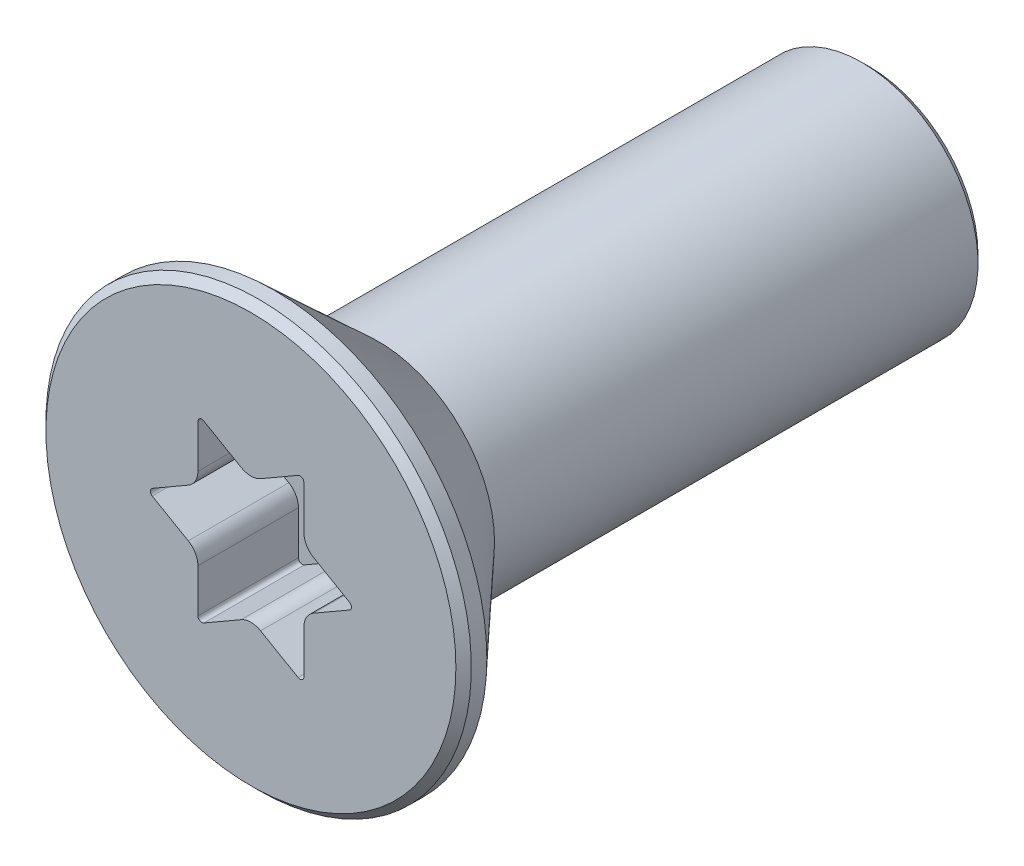
ISO-10303-21;
HEADER;
FILE_DESCRIPTION(('STEP AP214'),'2;1');
FILE_NAME('part.step','',(''),(''),'','','');
FILE_SCHEMA(('AUTOMOTIVE_DESIGN { 1 0 10303 214 1 1 1 1 }'));
ENDSEC;
DATA;
#1=APPLICATION_CONTEXT('core data for automotive mechanical design processes');
#2=APPLICATION_PROTOCOL_DEFINITION('international standard','automotive_design',2000,#1);
#3=PRODUCT_CONTEXT('',#1,'mechanical');
#4=PRODUCT('Part','Part','',(#3));
#5=PRODUCT_RELATED_PRODUCT_CATEGORY('part','',(#4));
#6=PRODUCT_DEFINITION_FORMATION('','',#4);
#7=PRODUCT_DEFINITION_CONTEXT('part definition',#1,'design');
#8=PRODUCT_DEFINITION('design','',#6,#7);
#9=PRODUCT_DEFINITION_SHAPE('','',#8);
#10=(LENGTH_UNIT() NAMED_UNIT(*) SI_UNIT(.MILLI.,.METRE.));
#11=(NAMED_UNIT(*) PLANE_ANGLE_UNIT() SI_UNIT($,.RADIAN.));
#12=(NAMED_UNIT(*) SI_UNIT($,.STERADIAN.) SOLID_ANGLE_UNIT());
#13=UNCERTAINTY_MEASURE_WITH_UNIT(LENGTH_MEASURE(1.E-05),#10,'distance_accuracy_value','');
#14=(GEOMETRIC_REPRESENTATION_CONTEXT(3) GLOBAL_UNCERTAINTY_ASSIGNED_CONTEXT((#13)) GLOBAL_UNIT_ASSIGNED_CONTEXT((#10,
#11,#12)) REPRESENTATION_CONTEXT('',''));
#15=CARTESIAN_POINT('',(0.,0.,0.));
#16=DIRECTION('',(0.,0.,1.));
#17=DIRECTION('',(1.,0.,0.));
#18=AXIS2_PLACEMENT_3D('',#15,#16,#17);
#19=CARTESIAN_POINT('',(7.2,-9.399999999998,210.95));
#20=DIRECTION('',(0.,0.,1.));
#21=DIRECTION('',(1.,0.,0.));
#22=AXIS2_PLACEMENT_3D('',#19,#20,#21);
#23=PLANE('',#22);
#24=CARTESIAN_POINT('',(7.2,-8.331902001998,210.95));
#25=DIRECTION('',(0.,0.,1.));
#26=DIRECTION('',(1.,0.,0.));
#27=AXIS2_PLACEMENT_3D('',#24,#25,#26);
#28=CIRCLE('',#27,0.25);
#29=CARTESIAN_POINT('',(7.07499999999879,-8.54840835294369,210.95));
#30=VERTEX_POINT('',#29);
#31=CARTESIAN_POINT('',(7.32500000000069,-8.54840835294385,210.95));
#32=VERTEX_POINT('',#31);
#33=EDGE_CURVE('E252',#30,#32,#28,.T.);
#34=ORIENTED_EDGE('',*,*,#33,.F.);
#35=DIRECTION('',(-0.866025403783983,0.50000000000079,0.));
#36=VECTOR('',#35,1.);
#37=CARTESIAN_POINT('',(6.832420150551,-8.408354811565,210.95));
#38=LINE('',#37,#36);
#39=CARTESIAN_POINT('',(6.58984030110494,-8.26830127018704,210.95));
#40=VERTEX_POINT('',#39);
#41=EDGE_CURVE('E348',#30,#40,#38,.T.);
#42=ORIENTED_EDGE('',*,*,#41,.T.);
#43=CARTESIAN_POINT('',(6.564840301107,-8.311602540377,210.95));
#44=DIRECTION('',(0.,0.,1.));
#45=DIRECTION('',(1.,0.,0.));
#46=AXIS2_PLACEMENT_3D('',#43,#44,#45);
#47=CIRCLE('',#46,0.05);
#48=CARTESIAN_POINT('',(6.514840301107,-8.311602539106,210.95));
#49=VERTEX_POINT('',#48);
#50=EDGE_CURVE('E248',#40,#49,#47,.T.);
#51=ORIENTED_EDGE('',*,*,#50,.T.);
#52=DIRECTION('',(0.,1.,0.));
#53=VECTOR('',#52,1.);
#54=CARTESIAN_POINT('',(6.514840301107,-8.591709615508,210.95));
#55=LINE('',#54,#53);
#56=CARTESIAN_POINT('',(6.514840301107,-8.871816705889,210.95));
#57=VERTEX_POINT('',#56);
#58=EDGE_CURVE('E251',#57,#49,#55,.T.);
#59=ORIENTED_EDGE('',*,*,#58,.F.);
#60=CARTESIAN_POINT('',(6.264840301107,-8.871816705889,210.95));
#61=DIRECTION('',(0.,0.,1.));
#62=DIRECTION('',(1.,0.,0.));
#63=AXIS2_PLACEMENT_3D('',#60,#61,#62);
#64=CIRCLE('',#63,0.25);
#65=CARTESIAN_POINT('',(6.38984030110702,-9.08832305683516,210.95));
#66=VERTEX_POINT('',#65);
#67=EDGE_CURVE('E244',#66,#57,#64,.T.);
#68=ORIENTED_EDGE('',*,*,#67,.F.);
#69=DIRECTION('',(-0.866025403784609,-0.499999999999705,0.));
#70=VECTOR('',#69,1.);
#71=CARTESIAN_POINT('',(6.157420150554,-9.222510893322,210.95));
#72=LINE('',#71,#70);
#73=CARTESIAN_POINT('',(5.92499999999999,-9.35669872980935,210.95));
#74=VERTEX_POINT('',#73);
#75=EDGE_CURVE('E343',#66,#74,#72,.T.);
#76=ORIENTED_EDGE('',*,*,#75,.T.);
#77=CARTESIAN_POINT('',(5.95,-9.399999999999,210.95));
#78=DIRECTION('',(0.,0.,1.));
#79=DIRECTION('',(1.,0.,0.));
#80=AXIS2_PLACEMENT_3D('',#77,#78,#79);
#81=CIRCLE('',#80,0.05);
#82=CARTESIAN_POINT('',(5.92499999999996,-9.4433012701882,210.95));
#83=VERTEX_POINT('',#82);
#84=EDGE_CURVE('E240',#74,#83,#81,.T.);
#85=ORIENTED_EDGE('',*,*,#84,.T.);
#86=DIRECTION('',(-0.866025403784609,0.499999999999705,0.));
#87=VECTOR('',#86,1.);
#88=CARTESIAN_POINT('',(6.157420150553,-9.577489106675,210.95));
#89=LINE('',#88,#87);
#90=CARTESIAN_POINT('',(6.38984030110658,-9.7116769431621,210.95));
#91=VERTEX_POINT('',#90);
#92=EDGE_CURVE('E243',#91,#83,#89,.T.);
#93=ORIENTED_EDGE('',*,*,#92,.F.);
#94=CARTESIAN_POINT('',(6.264840301107,-9.928183294108,210.95));
#95=DIRECTION('',(0.,0.,1.));
#96=DIRECTION('',(1.,0.,0.));
#97=AXIS2_PLACEMENT_3D('',#94,#95,#96);
#98=CIRCLE('',#97,0.250000000002);
#99=CARTESIAN_POINT('',(6.514840301108,-9.928183294108,210.95));
#100=VERTEX_POINT('',#99);
#101=EDGE_CURVE('E236',#100,#91,#98,.T.);
#102=ORIENTED_EDGE('',*,*,#101,.F.);
#103=DIRECTION('',(0.,1.,0.));
#104=VECTOR('',#103,1.);
#105=CARTESIAN_POINT('',(6.514840301107,-10.20829038449,210.95));
#106=LINE('',#105,#104);
#107=CARTESIAN_POINT('',(6.514840301107,-10.48839745962,210.95));
#108=VERTEX_POINT('',#107);
#109=EDGE_CURVE('E338',#108,#100,#106,.T.);
#110=ORIENTED_EDGE('',*,*,#109,.F.);
#111=CARTESIAN_POINT('',(6.564840301107,-10.48839745962,210.95));
#112=DIRECTION('',(0.,0.,1.));
#113=DIRECTION('',(1.,0.,0.));
#114=AXIS2_PLACEMENT_3D('',#111,#112,#113);
#115=CIRCLE('',#114,0.05);
#116=CARTESIAN_POINT('',(6.58984030110536,-10.53169872981,210.95));
#117=VERTEX_POINT('',#116);
#118=EDGE_CURVE('E232',#108,#117,#115,.T.);
#119=ORIENTED_EDGE('',*,*,#118,.T.);
#120=DIRECTION('',(-0.866025403781719,-0.500000000004711,0.));
#121=VECTOR('',#120,1.);
#122=CARTESIAN_POINT('',(6.832420150552,-10.39164518843,210.95));
#123=LINE('',#122,#121);
#124=CARTESIAN_POINT('',(7.07499999999758,-10.2515916470509,210.95));
#125=VERTEX_POINT('',#124);
#126=EDGE_CURVE('E235',#125,#117,#123,.T.);
#127=ORIENTED_EDGE('',*,*,#126,.F.);
#128=CARTESIAN_POINT('',(7.2,-10.468097998,210.95));
#129=DIRECTION('',(0.,0.,1.));
#130=DIRECTION('',(1.,0.,0.));
#131=AXIS2_PLACEMENT_3D('',#128,#129,#130);
#132=CIRCLE('',#131,0.25);
#133=CARTESIAN_POINT('',(7.32500000000358,-10.2515916470536,210.95));
#134=VERTEX_POINT('',#133);
#135=EDGE_CURVE('E228',#134,#125,#132,.T.);
#136=ORIENTED_EDGE('',*,*,#135,.F.);
#137=DIRECTION('',(-0.86602540378219,0.500000000003894,0.));
#138=VECTOR('',#137,1.);
#139=CARTESIAN_POINT('',(7.567579849449,-10.39164518843,210.95));
#140=LINE('',#139,#138);
#141=CARTESIAN_POINT('',(7.81015969889588,-10.5316987298096,210.95));
#142=VERTEX_POINT('',#141);
#143=EDGE_CURVE('E333',#142,#134,#140,.T.);
#144=ORIENTED_EDGE('',*,*,#143,.F.);
#145=CARTESIAN_POINT('',(7.835159698894,-10.48839745962,210.95));
#146=DIRECTION('',(0.,0.,1.));
#147=DIRECTION('',(1.,0.,0.));
#148=AXIS2_PLACEMENT_3D('',#145,#146,#147);
#149=CIRCLE('',#148,0.05);
#150=CARTESIAN_POINT('',(7.885159698894,-10.48839748249,210.95));
#151=VERTEX_POINT('',#150);
#152=EDGE_CURVE('E221',#142,#151,#149,.T.);
#153=ORIENTED_EDGE('',*,*,#152,.T.);
#154=DIRECTION('',(0.,1.,0.));
#155=VECTOR('',#154,1.);
#156=CARTESIAN_POINT('',(7.885159698894,-10.20829038449,210.95));
#157=LINE('',#156,#155);
#158=CARTESIAN_POINT('',(7.885159698894,-9.928183294108,210.95));
#159=VERTEX_POINT('',#158);
#160=EDGE_CURVE('E219',#151,#159,#157,.T.);
#161=ORIENTED_EDGE('',*,*,#160,.T.);
#162=CARTESIAN_POINT('',(8.135159698894,-9.928183294108,210.95));
#163=DIRECTION('',(0.,0.,1.));
#164=DIRECTION('',(1.,0.,0.));
#165=AXIS2_PLACEMENT_3D('',#162,#163,#164);
#166=CIRCLE('',#165,0.250000000002);
#167=CARTESIAN_POINT('',(8.01015969889355,-9.71167694316094,210.95));
#168=VERTEX_POINT('',#167);
#169=EDGE_CURVE('E216',#168,#159,#166,.T.);
#170=ORIENTED_EDGE('',*,*,#169,.F.);
#171=DIRECTION('',(-0.866025403784609,-0.499999999999705,0.));
#172=VECTOR('',#171,1.);
#173=CARTESIAN_POINT('',(8.242579849447,-9.577489106675,210.95));
#174=LINE('',#173,#172);
#175=CARTESIAN_POINT('',(8.47500000000005,-9.44330127018821,210.95));
#176=VERTEX_POINT('',#175);
#177=EDGE_CURVE('E329',#176,#168,#174,.T.);
#178=ORIENTED_EDGE('',*,*,#177,.F.);
#179=CARTESIAN_POINT('',(8.45,-9.399999999999,210.95));
#180=DIRECTION('',(0.,0.,1.));
#181=DIRECTION('',(1.,0.,0.));
#182=AXIS2_PLACEMENT_3D('',#179,#180,#181);
#183=CIRCLE('',#182,0.05);
#184=CARTESIAN_POINT('',(8.47499999999996,-9.35669872980947,210.95));
#185=VERTEX_POINT('',#184);
#186=EDGE_CURVE('E212',#176,#185,#183,.T.);
#187=ORIENTED_EDGE('',*,*,#186,.T.);
#188=DIRECTION('',(-0.866025403784274,0.500000000000285,0.));
#189=VECTOR('',#188,1.);
#190=CARTESIAN_POINT('',(8.2425798494469,-9.22251089332218,210.95));
#191=LINE('',#190,#189);
#192=CARTESIAN_POINT('',(8.01015969889387,-9.0883230568352,210.95));
#193=VERTEX_POINT('',#192);
#194=EDGE_CURVE('E211',#185,#193,#191,.T.);
#195=ORIENTED_EDGE('',*,*,#194,.T.);
#196=CARTESIAN_POINT('',(8.135159698894,-8.871816705889,210.95));
#197=DIRECTION('',(0.,0.,1.));
#198=DIRECTION('',(1.,0.,0.));
#199=AXIS2_PLACEMENT_3D('',#196,#197,#198);
#200=CIRCLE('',#199,0.25);
#201=CARTESIAN_POINT('',(7.885159698894,-8.871816705889,210.95));
#202=VERTEX_POINT('',#201);
#203=EDGE_CURVE('E199',#202,#193,#200,.T.);
#204=ORIENTED_EDGE('',*,*,#203,.F.);
#205=DIRECTION('',(0.,1.,0.));
#206=VECTOR('',#205,1.);
#207=CARTESIAN_POINT('',(7.885159698894,-8.591709615508,210.95));
#208=LINE('',#207,#206);
#209=CARTESIAN_POINT('',(7.885159698894,-8.3116025289405,210.95));
#210=VERTEX_POINT('',#209);
#211=EDGE_CURVE('E197',#202,#210,#208,.T.);
#212=ORIENTED_EDGE('',*,*,#211,.T.);
#213=CARTESIAN_POINT('',(7.835159698894,-8.311602540377,210.95));
#214=DIRECTION('',(0.,0.,1.));
#215=DIRECTION('',(1.,0.,0.));
#216=AXIS2_PLACEMENT_3D('',#213,#214,#215);
#217=CIRCLE('',#216,0.05);
#218=CARTESIAN_POINT('',(7.81015969889613,-8.26830127018662,210.95));
#219=VERTEX_POINT('',#218);
#220=EDGE_CURVE('E19',#210,#219,#217,.T.);
#221=ORIENTED_EDGE('',*,*,#220,.T.);
#222=DIRECTION('',(-0.866025403784386,-0.500000000000092,0.));
#223=VECTOR('',#222,1.);
#224=CARTESIAN_POINT('',(7.567579849449,-8.408354811565,210.95));
#225=LINE('',#224,#223);
#226=EDGE_CURVE('E195',#219,#32,#225,.T.);
#227=ORIENTED_EDGE('',*,*,#226,.T.);
#228=EDGE_LOOP('',(#34,#42,#51,#59,#68,#76,#85,#93,#102,#110,#119,#127,#136,#144,#153,#161,#170,
#178,#187,#195,#204,#212,#221,#227));
#229=FACE_BOUND('',#228,.T.);
#230=ADVANCED_FACE('F16',(#229),#23,.T.);
#231=CARTESIAN_POINT('',(7.567579849449,-8.408354811565,211.6));
#232=DIRECTION('',(-0.500000000000092,0.866025403784386,0.));
#233=DIRECTION('',(-0.866025403784386,-0.500000000000092,0.));
#234=AXIS2_PLACEMENT_3D('',#231,#232,#233);
#235=PLANE('',#234);
#236=ORIENTED_EDGE('',*,*,#226,.F.);
#237=DIRECTION('',(0.,0.,1.));
#238=VECTOR('',#237,1.);
#239=CARTESIAN_POINT('',(7.8101596988982,-8.26830127018535,210.924));
#240=LINE('',#239,#238);
#241=CARTESIAN_POINT('',(7.81015969889618,-8.26830127018665,212.25));
#242=VERTEX_POINT('',#241);
#243=EDGE_CURVE('E194',#219,#242,#240,.T.);
#244=ORIENTED_EDGE('',*,*,#243,.T.);
#245=DIRECTION('',(0.866025403784995,0.499999999999036,0.));
#246=VECTOR('',#245,1.);
#247=CARTESIAN_POINT('',(7.325000000003,-8.548408352942,212.25));
#248=LINE('',#247,#246);
#249=CARTESIAN_POINT('',(7.32500000000041,-8.54840835294368,212.25));
#250=VERTEX_POINT('',#249);
#251=EDGE_CURVE('E259',#250,#242,#248,.T.);
#252=ORIENTED_EDGE('',*,*,#251,.F.);
#253=DIRECTION('',(0.,0.,1.));
#254=VECTOR('',#253,1.);
#255=CARTESIAN_POINT('',(7.32500000000123,-8.5484083529434,210.924));
#256=LINE('',#255,#254);
#257=EDGE_CURVE('E255',#32,#250,#256,.T.);
#258=ORIENTED_EDGE('',*,*,#257,.F.);
#259=EDGE_LOOP('',(#236,#244,#252,#258));
#260=FACE_BOUND('',#259,.T.);
#261=ADVANCED_FACE('F743',(#260),#235,.F.);
#262=CARTESIAN_POINT('',(7.835159698894,-8.311602540377,210.924));
#263=DIRECTION('',(0.,0.,1.));
#264=DIRECTION('',(1.,0.,0.));
#265=AXIS2_PLACEMENT_3D('',#262,#263,#264);
#266=CYLINDRICAL_SURFACE('',#265,0.05);
#267=ORIENTED_EDGE('',*,*,#220,.F.);
#268=DIRECTION('',(0.,0.,-1.));
#269=VECTOR('',#268,1.);
#270=CARTESIAN_POINT('',(7.885159698894,-8.311602517504,211.6));
#271=LINE('',#270,#269);
#272=CARTESIAN_POINT('',(7.885159698894,-8.3116025289405,212.25));
#273=VERTEX_POINT('',#272);
#274=EDGE_CURVE('E191',#210,#273,#271,.F.);
#275=ORIENTED_EDGE('',*,*,#274,.T.);
#276=CARTESIAN_POINT('',(7.835159698894,-8.311602540377,212.25));
#277=DIRECTION('',(0.,0.,1.));
#278=DIRECTION('',(1.,0.,0.));
#279=AXIS2_PLACEMENT_3D('',#276,#277,#278);
#280=CIRCLE('',#279,0.05);
#281=EDGE_CURVE('E257',#242,#273,#280,.F.);
#282=ORIENTED_EDGE('',*,*,#281,.F.);
#283=ORIENTED_EDGE('',*,*,#243,.F.);
#284=EDGE_LOOP('',(#267,#275,#282,#283));
#285=FACE_BOUND('',#284,.T.);
#286=ADVANCED_FACE('F189',(#285),#266,.F.);
#287=CARTESIAN_POINT('',(7.885159698894,-8.591709615508,211.6));
#288=DIRECTION('',(1.,0.,0.));
#289=DIRECTION('',(0.,0.,-1.));
#290=AXIS2_PLACEMENT_3D('',#287,#288,#289);
#291=PLANE('',#290);
#292=ORIENTED_EDGE('',*,*,#211,.F.);
#293=DIRECTION('',(0.,0.,1.));
#294=VECTOR('',#293,1.);
#295=CARTESIAN_POINT('',(7.885159698894,-8.871816705889,210.924));
#296=LINE('',#295,#294);
#297=CARTESIAN_POINT('',(7.885159698894,-8.871816705889,212.25));
#298=VERTEX_POINT('',#297);
#299=EDGE_CURVE('E207',#298,#202,#296,.F.);
#300=ORIENTED_EDGE('',*,*,#299,.F.);
#301=DIRECTION('',(0.,1.,0.));
#302=VECTOR('',#301,1.);
#303=CARTESIAN_POINT('',(7.885159698894,-9.399999999999,212.25));
#304=LINE('',#303,#302);
#305=EDGE_CURVE('E205',#273,#298,#304,.F.);
#306=ORIENTED_EDGE('',*,*,#305,.F.);
#307=ORIENTED_EDGE('',*,*,#274,.F.);
#308=EDGE_LOOP('',(#292,#300,#306,#307));
#309=FACE_BOUND('',#308,.T.);
#310=ADVANCED_FACE('F203',(#309),#291,.F.);
#311=CARTESIAN_POINT('',(8.135159698894,-8.871816705889,210.924));
#312=DIRECTION('',(0.,0.,1.));
#313=DIRECTION('',(1.,0.,0.));
#314=AXIS2_PLACEMENT_3D('',#311,#312,#313);
#315=CYLINDRICAL_SURFACE('',#314,0.25);
#316=DIRECTION('',(1.60154489496387E-13,2.77395712867787E-13,1.));
#317=VECTOR('',#316,1.);
#318=CARTESIAN_POINT('',(8.01015969889399,-9.08832305683502,211.6));
#319=LINE('',#318,#317);
#320=CARTESIAN_POINT('',(8.01015969889385,-9.08832305683481,212.25));
#321=VERTEX_POINT('',#320);
#322=EDGE_CURVE('E215',#193,#321,#319,.T.);
#323=ORIENTED_EDGE('',*,*,#322,.T.);
#324=CARTESIAN_POINT('',(8.135159698894,-8.871816705889,212.25));
#325=DIRECTION('',(0.,0.,1.));
#326=DIRECTION('',(1.,0.,0.));
#327=AXIS2_PLACEMENT_3D('',#324,#325,#326);
#328=CIRCLE('',#327,0.25);
#329=EDGE_CURVE('E260',#298,#321,#328,.T.);
#330=ORIENTED_EDGE('',*,*,#329,.F.);
#331=ORIENTED_EDGE('',*,*,#299,.T.);
#332=ORIENTED_EDGE('',*,*,#203,.T.);
#333=EDGE_LOOP('',(#323,#330,#331,#332));
#334=FACE_BOUND('',#333,.T.);
#335=ADVANCED_FACE('F716',(#334),#315,.T.);
#336=CARTESIAN_POINT('',(8.242579849447,-9.222510893322,211.6));
#337=DIRECTION('',(0.500000000000285,0.866025403784274,-3.20308978992591E-13));
#338=DIRECTION('',(-0.866025403784274,0.500000000000285,0.));
#339=AXIS2_PLACEMENT_3D('',#336,#337,#338);
#340=PLANE('',#339);
#341=ORIENTED_EDGE('',*,*,#194,.F.);
#342=DIRECTION('',(0.,0.,1.));
#343=VECTOR('',#342,1.);
#344=CARTESIAN_POINT('',(8.47499999999966,-9.35669872980958,210.924));
#345=LINE('',#344,#343);
#346=CARTESIAN_POINT('',(8.47499999999983,-9.35669872980979,212.25));
#347=VERTEX_POINT('',#346);
#348=EDGE_CURVE('E214',#185,#347,#345,.T.);
#349=ORIENTED_EDGE('',*,*,#348,.T.);
#350=DIRECTION('',(0.866025403783417,-0.50000000000177,0.));
#351=VECTOR('',#350,1.);
#352=CARTESIAN_POINT('',(8.010159698894,-9.088323056835,212.25));
#353=LINE('',#352,#351);
#354=EDGE_CURVE('E263',#321,#347,#353,.T.);
#355=ORIENTED_EDGE('',*,*,#354,.F.);
#356=ORIENTED_EDGE('',*,*,#322,.F.);
#357=EDGE_LOOP('',(#341,#349,#355,#356));
#358=FACE_BOUND('',#357,.T.);
#359=ADVANCED_FACE('F706',(#358),#340,.F.);
#360=CARTESIAN_POINT('',(8.45,-9.399999999999,210.924));
#361=DIRECTION('',(0.,0.,1.));
#362=DIRECTION('',(1.,0.,0.));
#363=AXIS2_PLACEMENT_3D('',#360,#361,#362);
#364=CYLINDRICAL_SURFACE('',#363,0.05);
#365=ORIENTED_EDGE('',*,*,#186,.F.);
#366=DIRECTION('',(0.,0.,1.));
#367=VECTOR('',#366,1.);
#368=CARTESIAN_POINT('',(8.4750000000001,-9.44330127018818,211.6));
#369=LINE('',#368,#367);
#370=CARTESIAN_POINT('',(8.47499999999992,-9.44330127018817,212.25));
#371=VERTEX_POINT('',#370);
#372=EDGE_CURVE('E331',#371,#176,#369,.F.);
#373=ORIENTED_EDGE('',*,*,#372,.F.);
#374=CARTESIAN_POINT('',(8.45,-9.399999999999,212.25));
#375=DIRECTION('',(0.,0.,1.));
#376=DIRECTION('',(1.,0.,0.));
#377=AXIS2_PLACEMENT_3D('',#374,#375,#376);
#378=CIRCLE('',#377,0.05);
#379=EDGE_CURVE('E264',#347,#371,#378,.F.);
#380=ORIENTED_EDGE('',*,*,#379,.F.);
#381=ORIENTED_EDGE('',*,*,#348,.F.);
#382=EDGE_LOOP('',(#365,#373,#380,#381));
#383=FACE_BOUND('',#382,.T.);
#384=ADVANCED_FACE('F696',(#383),#364,.F.);
#385=CARTESIAN_POINT('',(8.242579849447,-9.577489106675,211.6));
#386=DIRECTION('',(-0.499999999999705,0.866025403784609,0.));
#387=DIRECTION('',(-0.866025403784609,-0.499999999999705,0.));
#388=AXIS2_PLACEMENT_3D('',#385,#386,#387);
#389=PLANE('',#388);
#390=DIRECTION('',(0.,0.,1.));
#391=VECTOR('',#390,1.);
#392=CARTESIAN_POINT('',(8.01015969889307,-9.71167694316012,210.924));
#393=LINE('',#392,#391);
#394=CARTESIAN_POINT('',(8.0101596988934,-9.71167694315985,212.25));
#395=VERTEX_POINT('',#394);
#396=EDGE_CURVE('E220',#395,#168,#393,.F.);
#397=ORIENTED_EDGE('',*,*,#396,.F.);
#398=DIRECTION('',(-0.866025403786304,-0.499999999996769,0.));
#399=VECTOR('',#398,1.);
#400=CARTESIAN_POINT('',(8.475,-9.443301270188,212.25));
#401=LINE('',#400,#399);
#402=EDGE_CURVE('E267',#371,#395,#401,.T.);
#403=ORIENTED_EDGE('',*,*,#402,.F.);
#404=ORIENTED_EDGE('',*,*,#372,.T.);
#405=ORIENTED_EDGE('',*,*,#177,.T.);
#406=EDGE_LOOP('',(#397,#403,#404,#405));
#407=FACE_BOUND('',#406,.T.);
#408=ADVANCED_FACE('F686',(#407),#389,.T.);
#409=CARTESIAN_POINT('',(8.135159698894,-9.928183294108,210.924));
#410=DIRECTION('',(0.,0.,1.));
#411=DIRECTION('',(1.,0.,0.));
#412=AXIS2_PLACEMENT_3D('',#409,#410,#411);
#413=CYLINDRICAL_SURFACE('',#412,0.250000000002);
#414=DIRECTION('',(0.,0.,-1.));
#415=VECTOR('',#414,1.);
#416=CARTESIAN_POINT('',(7.885159698894,-9.928183294108,211.6));
#417=LINE('',#416,#415);
#418=CARTESIAN_POINT('',(7.8851596988935,-9.928183294108,212.25));
#419=VERTEX_POINT('',#418);
#420=EDGE_CURVE('E224',#159,#419,#417,.F.);
#421=ORIENTED_EDGE('',*,*,#420,.T.);
#422=CARTESIAN_POINT('',(8.135159698894,-9.928183294108,212.25));
#423=DIRECTION('',(0.,0.,1.));
#424=DIRECTION('',(1.,0.,0.));
#425=AXIS2_PLACEMENT_3D('',#422,#423,#424);
#426=CIRCLE('',#425,0.250000000002);
#427=EDGE_CURVE('E268',#395,#419,#426,.T.);
#428=ORIENTED_EDGE('',*,*,#427,.F.);
#429=ORIENTED_EDGE('',*,*,#396,.T.);
#430=ORIENTED_EDGE('',*,*,#169,.T.);
#431=EDGE_LOOP('',(#421,#428,#429,#430));
#432=FACE_BOUND('',#431,.T.);
#433=ADVANCED_FACE('F676',(#432),#413,.T.);
#434=CARTESIAN_POINT('',(7.885159698894,-10.20829038449,211.6));
#435=DIRECTION('',(1.,0.,0.));
#436=DIRECTION('',(0.,0.,-1.));
#437=AXIS2_PLACEMENT_3D('',#434,#435,#436);
#438=PLANE('',#437);
#439=ORIENTED_EDGE('',*,*,#160,.F.);
#440=DIRECTION('',(0.,0.,-1.));
#441=VECTOR('',#440,1.);
#442=CARTESIAN_POINT('',(7.885159698894,-10.48839750536,211.6));
#443=LINE('',#442,#441);
#444=CARTESIAN_POINT('',(7.8851596988935,-10.48839748249,212.25));
#445=VERTEX_POINT('',#444);
#446=EDGE_CURVE('E223',#151,#445,#443,.F.);
#447=ORIENTED_EDGE('',*,*,#446,.T.);
#448=DIRECTION('',(0.,1.,0.));
#449=VECTOR('',#448,1.);
#450=CARTESIAN_POINT('',(7.885159698893,-9.399999999999,212.25));
#451=LINE('',#450,#449);
#452=EDGE_CURVE('E271',#419,#445,#451,.F.);
#453=ORIENTED_EDGE('',*,*,#452,.F.);
#454=ORIENTED_EDGE('',*,*,#420,.F.);
#455=EDGE_LOOP('',(#439,#447,#453,#454));
#456=FACE_BOUND('',#455,.T.);
#457=ADVANCED_FACE('F666',(#456),#438,.F.);
#458=CARTESIAN_POINT('',(7.835159698894,-10.48839745962,210.924));
#459=DIRECTION('',(0.,0.,1.));
#460=DIRECTION('',(1.,0.,0.));
#461=AXIS2_PLACEMENT_3D('',#458,#459,#460);
#462=CYLINDRICAL_SURFACE('',#461,0.05);
#463=ORIENTED_EDGE('',*,*,#152,.F.);
#464=DIRECTION('',(0.,0.,1.));
#465=VECTOR('',#464,1.);
#466=CARTESIAN_POINT('',(7.81015969889765,-10.5316987298106,211.6));
#467=LINE('',#466,#465);
#468=CARTESIAN_POINT('',(7.81015969889641,-10.5316987298095,212.25));
#469=VERTEX_POINT('',#468);
#470=EDGE_CURVE('E227',#469,#142,#467,.F.);
#471=ORIENTED_EDGE('',*,*,#470,.F.);
#472=CARTESIAN_POINT('',(7.835159698894,-10.48839745962,212.25));
#473=DIRECTION('',(0.,0.,1.));
#474=DIRECTION('',(1.,0.,0.));
#475=AXIS2_PLACEMENT_3D('',#472,#473,#474);
#476=CIRCLE('',#475,0.05);
#477=EDGE_CURVE('E272',#445,#469,#476,.F.);
#478=ORIENTED_EDGE('',*,*,#477,.F.);
#479=ORIENTED_EDGE('',*,*,#446,.F.);
#480=EDGE_LOOP('',(#463,#471,#478,#479));
#481=FACE_BOUND('',#480,.T.);
#482=ADVANCED_FACE('F656',(#481),#462,.F.);
#483=CARTESIAN_POINT('',(7.567579849449,-10.39164518843,211.6));
#484=DIRECTION('',(0.500000000003894,0.86602540378219,0.));
#485=DIRECTION('',(-0.86602540378219,0.500000000003894,0.));
#486=AXIS2_PLACEMENT_3D('',#483,#484,#485);
#487=PLANE('',#486);
#488=DIRECTION('',(0.,0.,1.));
#489=VECTOR('',#488,1.);
#490=CARTESIAN_POINT('',(7.32500000000415,-10.2515916470563,210.924));
#491=LINE('',#490,#489);
#492=CARTESIAN_POINT('',(7.32499999999973,-10.2515916470562,212.25));
#493=VERTEX_POINT('',#492);
#494=EDGE_CURVE('E231',#493,#134,#491,.F.);
#495=ORIENTED_EDGE('',*,*,#494,.F.);
#496=DIRECTION('',(-0.866025403790285,0.499999999989874,0.));
#497=VECTOR('',#496,1.);
#498=CARTESIAN_POINT('',(7.810159698898,-10.53169872981,212.25));
#499=LINE('',#498,#497);
#500=EDGE_CURVE('E275',#469,#493,#499,.T.);
#501=ORIENTED_EDGE('',*,*,#500,.F.);
#502=ORIENTED_EDGE('',*,*,#470,.T.);
#503=ORIENTED_EDGE('',*,*,#143,.T.);
#504=EDGE_LOOP('',(#495,#501,#502,#503));
#505=FACE_BOUND('',#504,.T.);
#506=ADVANCED_FACE('F646',(#505),#487,.T.);
#507=CARTESIAN_POINT('',(7.2,-10.468097998,210.924));
#508=DIRECTION('',(0.,0.,1.));
#509=DIRECTION('',(1.,0.,0.));
#510=AXIS2_PLACEMENT_3D('',#507,#508,#509);
#511=CYLINDRICAL_SURFACE('',#510,0.25);
#512=CARTESIAN_POINT('',(7.2,-10.468097998,212.25));
#513=DIRECTION('',(0.,0.,1.));
#514=DIRECTION('',(1.,0.,0.));
#515=AXIS2_PLACEMENT_3D('',#512,#513,#514);
#516=CIRCLE('',#515,0.25);
#517=CARTESIAN_POINT('',(7.07499999999783,-10.2515916470504,212.25));
#518=VERTEX_POINT('',#517);
#519=EDGE_CURVE('E276',#493,#518,#516,.T.);
#520=ORIENTED_EDGE('',*,*,#519,.F.);
#521=ORIENTED_EDGE('',*,*,#494,.T.);
#522=ORIENTED_EDGE('',*,*,#135,.T.);
#523=DIRECTION('',(0.,0.,1.));
#524=VECTOR('',#523,1.);
#525=CARTESIAN_POINT('',(7.07499999999826,-10.2515916470505,211.6));
#526=LINE('',#525,#524);
#527=EDGE_CURVE('E230',#518,#125,#526,.F.);
#528=ORIENTED_EDGE('',*,*,#527,.F.);
#529=EDGE_LOOP('',(#520,#521,#522,#528));
#530=FACE_BOUND('',#529,.T.);
#531=ADVANCED_FACE('F636',(#530),#511,.T.);
#532=CARTESIAN_POINT('',(6.832420150552,-10.39164518843,211.6));
#533=DIRECTION('',(-0.500000000004711,0.866025403781719,0.));
#534=DIRECTION('',(-0.866025403781719,-0.500000000004711,0.));
#535=AXIS2_PLACEMENT_3D('',#532,#533,#534);
#536=PLANE('',#535);
#537=DIRECTION('',(0.,0.,1.));
#538=VECTOR('',#537,1.);
#539=CARTESIAN_POINT('',(6.58984030110366,-10.5316987298111,210.924));
#540=LINE('',#539,#538);
#541=CARTESIAN_POINT('',(6.58984030110467,-10.5316987298089,212.25));
#542=VERTEX_POINT('',#541);
#543=EDGE_CURVE('E234',#117,#542,#540,.T.);
#544=ORIENTED_EDGE('',*,*,#543,.T.);
#545=DIRECTION('',(-0.866025403783449,-0.500000000001713,0.));
#546=VECTOR('',#545,1.);
#547=CARTESIAN_POINT('',(7.074999999998,-10.25159164705,212.25));
#548=LINE('',#547,#546);
#549=EDGE_CURVE('E279',#518,#542,#548,.T.);
#550=ORIENTED_EDGE('',*,*,#549,.F.);
#551=ORIENTED_EDGE('',*,*,#527,.T.);
#552=ORIENTED_EDGE('',*,*,#126,.T.);
#553=EDGE_LOOP('',(#544,#550,#551,#552));
#554=FACE_BOUND('',#553,.T.);
#555=ADVANCED_FACE('F626',(#554),#536,.T.);
#556=CARTESIAN_POINT('',(6.564840301107,-10.48839745962,210.924));
#557=DIRECTION('',(0.,0.,1.));
#558=DIRECTION('',(1.,0.,0.));
#559=AXIS2_PLACEMENT_3D('',#556,#557,#558);
#560=CYLINDRICAL_SURFACE('',#559,0.05);
#561=ORIENTED_EDGE('',*,*,#118,.F.);
#562=DIRECTION('',(0.,0.,-1.));
#563=VECTOR('',#562,1.);
#564=CARTESIAN_POINT('',(6.514840301107,-10.48839745962,211.6));
#565=LINE('',#564,#563);
#566=CARTESIAN_POINT('',(6.514840301107,-10.48839745962,212.25));
#567=VERTEX_POINT('',#566);
#568=EDGE_CURVE('E340',#567,#108,#565,.T.);
#569=ORIENTED_EDGE('',*,*,#568,.F.);
#570=CARTESIAN_POINT('',(6.564840301107,-10.48839745962,212.25));
#571=DIRECTION('',(0.,0.,1.));
#572=DIRECTION('',(1.,0.,0.));
#573=AXIS2_PLACEMENT_3D('',#570,#571,#572);
#574=CIRCLE('',#573,0.05);
#575=EDGE_CURVE('E280',#542,#567,#574,.F.);
#576=ORIENTED_EDGE('',*,*,#575,.F.);
#577=ORIENTED_EDGE('',*,*,#543,.F.);
#578=EDGE_LOOP('',(#561,#569,#576,#577));
#579=FACE_BOUND('',#578,.T.);
#580=ADVANCED_FACE('F616',(#579),#560,.F.);
#581=CARTESIAN_POINT('',(6.514840301107,-10.20829038449,211.6));
#582=DIRECTION('',(1.,0.,0.));
#583=DIRECTION('',(0.,0.,-1.));
#584=AXIS2_PLACEMENT_3D('',#581,#582,#583);
#585=PLANE('',#584);
#586=DIRECTION('',(0.,0.,1.));
#587=VECTOR('',#586,1.);
#588=CARTESIAN_POINT('',(6.514840301109,-9.928183294108,210.924));
#589=LINE('',#588,#587);
#590=CARTESIAN_POINT('',(6.514840301108,-9.928183294108,212.25));
#591=VERTEX_POINT('',#590);
#592=EDGE_CURVE('E239',#591,#100,#589,.F.);
#593=ORIENTED_EDGE('',*,*,#592,.F.);
#594=DIRECTION('',(0.,1.,0.));
#595=VECTOR('',#594,1.);
#596=CARTESIAN_POINT('',(6.514840301107,-9.399999999999,212.25));
#597=LINE('',#596,#595);
#598=EDGE_CURVE('E283',#567,#591,#597,.T.);
#599=ORIENTED_EDGE('',*,*,#598,.F.);
#600=ORIENTED_EDGE('',*,*,#568,.T.);
#601=ORIENTED_EDGE('',*,*,#109,.T.);
#602=EDGE_LOOP('',(#593,#599,#600,#601));
#603=FACE_BOUND('',#602,.T.);
#604=ADVANCED_FACE('F606',(#603),#585,.T.);
#605=CARTESIAN_POINT('',(6.264840301107,-9.928183294108,210.924));
#606=DIRECTION('',(0.,0.,1.));
#607=DIRECTION('',(1.,0.,0.));
#608=AXIS2_PLACEMENT_3D('',#605,#606,#607);
#609=CYLINDRICAL_SURFACE('',#608,0.250000000002);
#610=DIRECTION('',(0.,0.,1.));
#611=VECTOR('',#610,1.);
#612=CARTESIAN_POINT('',(6.38984030110642,-9.71167694316201,211.6));
#613=LINE('',#612,#611);
#614=CARTESIAN_POINT('',(6.38984030110667,-9.71167694316148,212.25));
#615=VERTEX_POINT('',#614);
#616=EDGE_CURVE('E238',#615,#91,#613,.F.);
#617=ORIENTED_EDGE('',*,*,#616,.F.);
#618=CARTESIAN_POINT('',(6.264840301107,-9.928183294108,212.25));
#619=DIRECTION('',(0.,0.,1.));
#620=DIRECTION('',(1.,0.,0.));
#621=AXIS2_PLACEMENT_3D('',#618,#619,#620);
#622=CIRCLE('',#621,0.250000000002);
#623=EDGE_CURVE('E284',#591,#615,#622,.T.);
#624=ORIENTED_EDGE('',*,*,#623,.F.);
#625=ORIENTED_EDGE('',*,*,#592,.T.);
#626=ORIENTED_EDGE('',*,*,#101,.T.);
#627=EDGE_LOOP('',(#617,#624,#625,#626));
#628=FACE_BOUND('',#627,.T.);
#629=ADVANCED_FACE('F596',(#628),#609,.T.);
#630=CARTESIAN_POINT('',(6.157420150553,-9.577489106675,211.6));
#631=DIRECTION('',(0.499999999999705,0.866025403784609,0.));
#632=DIRECTION('',(-0.866025403784609,0.499999999999705,0.));
#633=AXIS2_PLACEMENT_3D('',#630,#631,#632);
#634=PLANE('',#633);
#635=DIRECTION('',(0.,0.,1.));
#636=VECTOR('',#635,1.);
#637=CARTESIAN_POINT('',(5.9249999999999,-9.44330127018817,210.924));
#638=LINE('',#637,#636);
#639=CARTESIAN_POINT('',(5.92500000000005,-9.44330127018814,212.25));
#640=VERTEX_POINT('',#639);
#641=EDGE_CURVE('E242',#83,#640,#638,.T.);
#642=ORIENTED_EDGE('',*,*,#641,.T.);
#643=DIRECTION('',(-0.866025403785497,0.499999999998167,0.));
#644=VECTOR('',#643,1.);
#645=CARTESIAN_POINT('',(6.389840301107,-9.711676943161,212.25));
#646=LINE('',#645,#644);
#647=EDGE_CURVE('E287',#615,#640,#646,.T.);
#648=ORIENTED_EDGE('',*,*,#647,.F.);
#649=ORIENTED_EDGE('',*,*,#616,.T.);
#650=ORIENTED_EDGE('',*,*,#92,.T.);
#651=EDGE_LOOP('',(#642,#648,#649,#650));
#652=FACE_BOUND('',#651,.T.);
#653=ADVANCED_FACE('F586',(#652),#634,.T.);
#654=CARTESIAN_POINT('',(5.95,-9.399999999999,210.924));
#655=DIRECTION('',(0.,0.,1.));
#656=DIRECTION('',(1.,0.,0.));
#657=AXIS2_PLACEMENT_3D('',#654,#655,#656);
#658=CYLINDRICAL_SURFACE('',#657,0.05);
#659=ORIENTED_EDGE('',*,*,#84,.F.);
#660=DIRECTION('',(0.,0.,1.));
#661=VECTOR('',#660,1.);
#662=CARTESIAN_POINT('',(5.92500000000015,-9.35669872980925,211.6));
#663=LINE('',#662,#661);
#664=CARTESIAN_POINT('',(5.92499999999992,-9.35669872980922,212.25));
#665=VERTEX_POINT('',#664);
#666=EDGE_CURVE('E345',#74,#665,#663,.T.);
#667=ORIENTED_EDGE('',*,*,#666,.T.);
#668=CARTESIAN_POINT('',(5.95,-9.399999999999,212.25));
#669=DIRECTION('',(0.,0.,1.));
#670=DIRECTION('',(1.,0.,0.));
#671=AXIS2_PLACEMENT_3D('',#668,#669,#670);
#672=CIRCLE('',#671,0.05);
#673=EDGE_CURVE('E288',#640,#665,#672,.F.);
#674=ORIENTED_EDGE('',*,*,#673,.F.);
#675=ORIENTED_EDGE('',*,*,#641,.F.);
#676=EDGE_LOOP('',(#659,#667,#674,#675));
#677=FACE_BOUND('',#676,.T.);
#678=ADVANCED_FACE('F576',(#677),#658,.F.);
#679=CARTESIAN_POINT('',(6.157420150554,-9.222510893322,211.6));
#680=DIRECTION('',(-0.499999999999705,0.866025403784609,0.));
#681=DIRECTION('',(-0.866025403784609,-0.499999999999705,0.));
#682=AXIS2_PLACEMENT_3D('',#679,#680,#681);
#683=PLANE('',#682);
#684=ORIENTED_EDGE('',*,*,#75,.F.);
#685=DIRECTION('',(0.,0.,1.));
#686=VECTOR('',#685,1.);
#687=CARTESIAN_POINT('',(6.38984030110705,-9.08832305683508,210.924));
#688=LINE('',#687,#686);
#689=CARTESIAN_POINT('',(6.38984030110695,-9.08832305683509,212.25));
#690=VERTEX_POINT('',#689);
#691=EDGE_CURVE('E247',#690,#66,#688,.F.);
#692=ORIENTED_EDGE('',*,*,#691,.F.);
#693=DIRECTION('',(0.86602540378469,0.499999999999565,0.));
#694=VECTOR('',#693,1.);
#695=CARTESIAN_POINT('',(5.925,-9.356698729809,212.25));
#696=LINE('',#695,#694);
#697=EDGE_CURVE('E291',#665,#690,#696,.T.);
#698=ORIENTED_EDGE('',*,*,#697,.F.);
#699=ORIENTED_EDGE('',*,*,#666,.F.);
#700=EDGE_LOOP('',(#684,#692,#698,#699));
#701=FACE_BOUND('',#700,.T.);
#702=ADVANCED_FACE('F566',(#701),#683,.F.);
#703=CARTESIAN_POINT('',(6.264840301107,-8.871816705889,210.924));
#704=DIRECTION('',(0.,0.,1.));
#705=DIRECTION('',(1.,0.,0.));
#706=AXIS2_PLACEMENT_3D('',#703,#704,#705);
#707=CYLINDRICAL_SURFACE('',#706,0.25);
#708=DIRECTION('',(0.,0.,-1.));
#709=VECTOR('',#708,1.);
#710=CARTESIAN_POINT('',(6.514840301107,-8.871816705889,211.6));
#711=LINE('',#710,#709);
#712=CARTESIAN_POINT('',(6.514840301107,-8.871816705889,212.25));
#713=VERTEX_POINT('',#712);
#714=EDGE_CURVE('E246',#713,#57,#711,.T.);
#715=ORIENTED_EDGE('',*,*,#714,.F.);
#716=CARTESIAN_POINT('',(6.264840301107,-8.871816705889,212.25));
#717=DIRECTION('',(0.,0.,1.));
#718=DIRECTION('',(1.,0.,0.));
#719=AXIS2_PLACEMENT_3D('',#716,#717,#718);
#720=CIRCLE('',#719,0.25);
#721=EDGE_CURVE('E292',#690,#713,#720,.T.);
#722=ORIENTED_EDGE('',*,*,#721,.F.);
#723=ORIENTED_EDGE('',*,*,#691,.T.);
#724=ORIENTED_EDGE('',*,*,#67,.T.);
#725=EDGE_LOOP('',(#715,#722,#723,#724));
#726=FACE_BOUND('',#725,.T.);
#727=ADVANCED_FACE('F556',(#726),#707,.T.);
#728=CARTESIAN_POINT('',(6.514840301107,-8.591709615508,211.6));
#729=DIRECTION('',(1.,0.,0.));
#730=DIRECTION('',(0.,0.,-1.));
#731=AXIS2_PLACEMENT_3D('',#728,#729,#730);
#732=PLANE('',#731);
#733=DIRECTION('',(0.,0.,1.));
#734=VECTOR('',#733,1.);
#735=CARTESIAN_POINT('',(6.514840301107,-8.311602537835,210.924));
#736=LINE('',#735,#734);
#737=CARTESIAN_POINT('',(6.514840301107,-8.311602539106,212.25));
#738=VERTEX_POINT('',#737);
#739=EDGE_CURVE('E250',#49,#738,#736,.T.);
#740=ORIENTED_EDGE('',*,*,#739,.T.);
#741=DIRECTION('',(0.,1.,0.));
#742=VECTOR('',#741,1.);
#743=CARTESIAN_POINT('',(6.514840301107,-9.399999999999,212.25));
#744=LINE('',#743,#742);
#745=EDGE_CURVE('E295',#713,#738,#744,.T.);
#746=ORIENTED_EDGE('',*,*,#745,.F.);
#747=ORIENTED_EDGE('',*,*,#714,.T.);
#748=ORIENTED_EDGE('',*,*,#58,.T.);
#749=EDGE_LOOP('',(#740,#746,#747,#748));
#750=FACE_BOUND('',#749,.T.);
#751=ADVANCED_FACE('F546',(#750),#732,.T.);
#752=CARTESIAN_POINT('',(6.564840301107,-8.311602540377,210.924));
#753=DIRECTION('',(0.,0.,1.));
#754=DIRECTION('',(1.,0.,0.));
#755=AXIS2_PLACEMENT_3D('',#752,#753,#754);
#756=CYLINDRICAL_SURFACE('',#755,0.05);
#757=ORIENTED_EDGE('',*,*,#50,.F.);
#758=DIRECTION('',(0.,0.,1.));
#759=VECTOR('',#758,1.);
#760=CARTESIAN_POINT('',(6.58984030110303,-8.26830127018594,211.6));
#761=LINE('',#760,#759);
#762=CARTESIAN_POINT('',(6.58984030110515,-8.2683012701867,212.25));
#763=VERTEX_POINT('',#762);
#764=EDGE_CURVE('E351',#40,#763,#761,.T.);
#765=ORIENTED_EDGE('',*,*,#764,.T.);
#766=CARTESIAN_POINT('',(6.564840301107,-8.311602540377,212.25));
#767=DIRECTION('',(0.,0.,1.));
#768=DIRECTION('',(1.,0.,0.));
#769=AXIS2_PLACEMENT_3D('',#766,#767,#768);
#770=CIRCLE('',#769,0.05);
#771=EDGE_CURVE('E296',#738,#763,#770,.F.);
#772=ORIENTED_EDGE('',*,*,#771,.F.);
#773=ORIENTED_EDGE('',*,*,#739,.F.);
#774=EDGE_LOOP('',(#757,#765,#772,#773));
#775=FACE_BOUND('',#774,.T.);
#776=ADVANCED_FACE('F536',(#775),#756,.F.);
#777=CARTESIAN_POINT('',(6.832420150551,-8.408354811565,211.6));
#778=DIRECTION('',(0.50000000000079,0.866025403783983,0.));
#779=DIRECTION('',(-0.866025403783983,0.50000000000079,0.));
#780=AXIS2_PLACEMENT_3D('',#777,#778,#779);
#781=PLANE('',#780);
#782=ORIENTED_EDGE('',*,*,#41,.F.);
#783=DIRECTION('',(0.,0.,1.));
#784=VECTOR('',#783,1.);
#785=CARTESIAN_POINT('',(7.07499999999802,-8.54840835294297,210.924));
#786=LINE('',#785,#784);
#787=CARTESIAN_POINT('',(7.07499999999883,-8.54840835294346,212.25));
#788=VERTEX_POINT('',#787);
#789=EDGE_CURVE('E256',#788,#30,#786,.F.);
#790=ORIENTED_EDGE('',*,*,#789,.F.);
#791=DIRECTION('',(0.866025403783657,-0.500000000001355,0.));
#792=VECTOR('',#791,1.);
#793=CARTESIAN_POINT('',(6.589840301103,-8.268301270185,212.25));
#794=LINE('',#793,#792);
#795=EDGE_CURVE('E299',#763,#788,#794,.T.);
#796=ORIENTED_EDGE('',*,*,#795,.F.);
#797=ORIENTED_EDGE('',*,*,#764,.F.);
#798=EDGE_LOOP('',(#782,#790,#796,#797));
#799=FACE_BOUND('',#798,.T.);
#800=ADVANCED_FACE('F526',(#799),#781,.F.);
#801=CARTESIAN_POINT('',(7.2,-8.331902001998,210.924));
#802=DIRECTION('',(0.,0.,1.));
#803=DIRECTION('',(1.,0.,0.));
#804=AXIS2_PLACEMENT_3D('',#801,#802,#803);
#805=CYLINDRICAL_SURFACE('',#804,0.25);
#806=CARTESIAN_POINT('',(7.2,-8.331902001998,212.25));
#807=DIRECTION('',(0.,0.,1.));
#808=DIRECTION('',(1.,0.,0.));
#809=AXIS2_PLACEMENT_3D('',#806,#807,#808);
#810=CIRCLE('',#809,0.25);
#811=EDGE_CURVE('E300',#788,#250,#810,.T.);
#812=ORIENTED_EDGE('',*,*,#811,.F.);
#813=ORIENTED_EDGE('',*,*,#789,.T.);
#814=ORIENTED_EDGE('',*,*,#33,.T.);
#815=ORIENTED_EDGE('',*,*,#257,.T.);
#816=EDGE_LOOP('',(#812,#813,#814,#815));
#817=FACE_BOUND('',#816,.T.);
#818=ADVANCED_FACE('F516',(#817),#805,.T.);
#819=CARTESIAN_POINT('',(7.2,-9.399999999999,212.25));
#820=DIRECTION('',(0.,0.,1.));
#821=DIRECTION('',(1.,0.,0.));
#822=AXIS2_PLACEMENT_3D('',#819,#820,#821);
#823=PLANE('',#822);
#824=ORIENTED_EDGE('',*,*,#795,.T.);
#825=ORIENTED_EDGE('',*,*,#811,.T.);
#826=ORIENTED_EDGE('',*,*,#251,.T.);
#827=ORIENTED_EDGE('',*,*,#281,.T.);
#828=ORIENTED_EDGE('',*,*,#305,.T.);
#829=ORIENTED_EDGE('',*,*,#329,.T.);
#830=ORIENTED_EDGE('',*,*,#354,.T.);
#831=ORIENTED_EDGE('',*,*,#379,.T.);
#832=ORIENTED_EDGE('',*,*,#402,.T.);
#833=ORIENTED_EDGE('',*,*,#427,.T.);
#834=ORIENTED_EDGE('',*,*,#452,.T.);
#835=ORIENTED_EDGE('',*,*,#477,.T.);
#836=ORIENTED_EDGE('',*,*,#500,.T.);
#837=ORIENTED_EDGE('',*,*,#519,.T.);
#838=ORIENTED_EDGE('',*,*,#549,.T.);
#839=ORIENTED_EDGE('',*,*,#575,.T.);
#840=ORIENTED_EDGE('',*,*,#598,.T.);
#841=ORIENTED_EDGE('',*,*,#623,.T.);
#842=ORIENTED_EDGE('',*,*,#647,.T.);
#843=ORIENTED_EDGE('',*,*,#673,.T.);
#844=ORIENTED_EDGE('',*,*,#697,.T.);
#845=ORIENTED_EDGE('',*,*,#721,.T.);
#846=ORIENTED_EDGE('',*,*,#745,.T.);
#847=ORIENTED_EDGE('',*,*,#771,.T.);
#848=EDGE_LOOP('',(#824,#825,#826,#827,#828,#829,#830,#831,#832,#833,#834,#835,#836,#837,#838,
#839,#840,#841,#842,#843,#844,#845,#846,#847));
#849=FACE_BOUND('',#848,.T.);
#850=CARTESIAN_POINT('',(7.20000000000001,-9.399999999999,212.25));
#851=DIRECTION('',(0.,0.,1.));
#852=DIRECTION('',(1.,0.,0.));
#853=AXIS2_PLACEMENT_3D('',#850,#851,#852);
#854=CIRCLE('',#853,2.65009344191388);
#855=CARTESIAN_POINT('',(9.85009344191389,-9.399999999999,212.25));
#856=VERTEX_POINT('',#855);
#857=EDGE_CURVE('E303',#856,#856,#854,.F.);
#858=ORIENTED_EDGE('',*,*,#857,.F.);
#859=EDGE_LOOP('',(#858));
#860=FACE_BOUND('',#859,.T.);
#861=ADVANCED_FACE('F506',(#849,#860),#823,.T.);
#862=CARTESIAN_POINT('',(7.2,-9.399999999999,212.149435536787));
#863=DIRECTION('',(0.,0.,-1.));
#864=DIRECTION('',(0.,1.,0.));
#865=AXIS2_PLACEMENT_3D('',#862,#863,#864);
#866=CONICAL_SURFACE('',#865,2.75066145126148,0.785415794239357);
#867=CARTESIAN_POINT('',(7.2,-9.399999999999,212.150096964725));
#868=DIRECTION('',(0.,0.,-1.));
#869=DIRECTION('',(0.,1.,0.));
#870=AXIS2_PLACEMENT_3D('',#867,#868,#869);
#871=CIRCLE('',#870,2.75);
#872=CARTESIAN_POINT('',(7.2,-6.649999999999,212.150096964725));
#873=VERTEX_POINT('',#872);
#874=EDGE_CURVE('E306',#873,#873,#871,.T.);
#875=ORIENTED_EDGE('',*,*,#874,.F.);
#876=EDGE_LOOP('',(#875));
#877=FACE_BOUND('',#876,.T.);
#878=ORIENTED_EDGE('',*,*,#857,.T.);
#879=EDGE_LOOP('',(#878));
#880=FACE_BOUND('',#879,.T.);
#881=ADVANCED_FACE('F497',(#877,#880),#866,.T.);
#882=CARTESIAN_POINT('',(7.2,-9.399999999999,212.1633981837));
#883=DIRECTION('',(0.,0.,-1.));
#884=DIRECTION('',(-1.,0.,0.));
#885=AXIS2_PLACEMENT_3D('',#882,#883,#884);
#886=CYLINDRICAL_SURFACE('',#885,2.75);
#887=CARTESIAN_POINT('',(7.2,-9.399999999999,211.949805769554));
#888=DIRECTION('',(0.,0.,1.));
#889=DIRECTION('',(1.,0.,0.));
#890=AXIS2_PLACEMENT_3D('',#887,#888,#889);
#891=CIRCLE('',#890,2.75);
#892=CARTESIAN_POINT('',(9.95,-9.399999999999,211.949805769554));
#893=VERTEX_POINT('',#892);
#894=EDGE_CURVE('E313',#893,#893,#891,.F.);
#895=ORIENTED_EDGE('',*,*,#894,.F.);
#896=EDGE_LOOP('',(#895));
#897=FACE_BOUND('',#896,.T.);
#898=ORIENTED_EDGE('',*,*,#874,.T.);
#899=EDGE_LOOP('',(#898));
#900=FACE_BOUND('',#899,.T.);
#901=ADVANCED_FACE('F454',(#897,#900),#886,.T.);
#902=CARTESIAN_POINT('',(7.2,-9.399999999999,204.350561153205));
#903=DIRECTION('',(0.,0.,1.));
#904=DIRECTION('',(0.,-1.,0.));
#905=AXIS2_PLACEMENT_3D('',#902,#903,#904);
#906=CONICAL_SURFACE('',#905,1.50082283362253,0.785485349838693);
#907=CARTESIAN_POINT('',(7.20000051835715,-10.9001524302975,204.349890866808));
#908=CARTESIAN_POINT('',(7.20000049531806,-10.8959824453677,204.345721608984));
#909=CARTESIAN_POINT('',(7.20000047245907,-10.8918124604657,204.341552351132));
#910=CARTESIAN_POINT('',(7.20000042710132,-10.8834724906428,204.33321383539));
#911=CARTESIAN_POINT('',(7.20000040460255,-10.8793025057219,204.3290445775));
#912=CARTESIAN_POINT('',(7.20000035996524,-10.8709625358813,204.320706061794));
#913=CARTESIAN_POINT('',(7.2000003378267,-10.8667925509615,204.316536803979));
#914=CARTESIAN_POINT('',(7.20000029390983,-10.8584525811363,204.308198288315));
#915=CARTESIAN_POINT('',(7.2000002721315,-10.8542825962308,204.304029030466));
#916=CARTESIAN_POINT('',(7.20000022893507,-10.8459426264185,204.29569051477));
#917=CARTESIAN_POINT('',(7.20000020751697,-10.8417726415117,204.291521256923));
#918=CARTESIAN_POINT('',(7.20000016504098,-10.8334326716701,204.283182741237));
#919=CARTESIAN_POINT('',(7.2000001439831,-10.8292626867352,204.279013483399));
#920=CARTESIAN_POINT('',(7.20000010222755,-10.8209227168749,204.270674967694));
#921=CARTESIAN_POINT('',(7.20000008152989,-10.8167527319494,204.266505709828));
#922=CARTESIAN_POINT('',(7.20000004049478,-10.8084127621174,204.258167194114));
#923=CARTESIAN_POINT('',(7.20000002015733,-10.8042427772109,204.253997936266));
#924=CARTESIAN_POINT('',(7.2,-10.8000727922949,204.249828678428));
#925=B_SPLINE_CURVE_WITH_KNOTS('',3,(#907,#908,#909,#910,#911,#912,#913,#914,#915,#916,#917,
#918,#919,#920,#921,#922,#923,#924),.UNSPECIFIED.,.F.,.F.,(4,2,2,2,2,2,2,2,4),(0.,
0.0176902053715472,0.035380410863671,0.0530706161950228,0.0707608215665638,0.0884510269381021,
0.106141232349838,0.123831437801761,0.141521643173295),.UNSPECIFIED.);
#926=CARTESIAN_POINT('',(7.20000035250645,-10.9000637667608,204.349901950423));
#927=VERTEX_POINT('',#926);
#928=CARTESIAN_POINT('',(7.20000000041436,-10.8002441437018,204.249999999973));
#929=VERTEX_POINT('',#928);
#930=EDGE_CURVE('E314',#927,#929,#925,.T.);
#931=ORIENTED_EDGE('',*,*,#930,.T.);
#932=CARTESIAN_POINT('',(7.20000000000001,-9.399999999999,204.25));
#933=DIRECTION('',(0.,0.,1.));
#934=DIRECTION('',(1.,0.,0.));
#935=AXIS2_PLACEMENT_3D('',#932,#933,#934);
#936=CIRCLE('',#935,1.4002441437499);
#937=CARTESIAN_POINT('',(7.1999999999163,-7.99975585629619,204.249999999973));
#938=VERTEX_POINT('',#937);
#939=EDGE_CURVE('E311',#929,#938,#936,.T.);
#940=ORIENTED_EDGE('',*,*,#939,.T.);
#941=CARTESIAN_POINT('',(7.2,-7.99996147092643,204.249794421173));
#942=CARTESIAN_POINT('',(7.19999999660423,-7.99579005838929,204.253965106427));
#943=CARTESIAN_POINT('',(7.19999999317811,-7.9916186458336,204.258135791662));
#944=CARTESIAN_POINT('',(7.19999998626516,-7.98327582072223,204.266477162113));
#945=CARTESIAN_POINT('',(7.19999998277833,-7.97910440816655,204.270647847329));
#946=CARTESIAN_POINT('',(7.19999997574397,-7.97076158306384,204.278989217788));
#947=CARTESIAN_POINT('',(7.19999997219644,-7.96659017051681,204.283159903032));
#948=CARTESIAN_POINT('',(7.19999996504067,-7.95824734541655,204.291501273513));
#949=CARTESIAN_POINT('',(7.19999996143243,-7.9540759328633,204.29567195875));
#950=CARTESIAN_POINT('',(7.19999995415524,-7.94573310776356,204.304013329232));
#951=CARTESIAN_POINT('',(7.1999999504863,-7.94156169521706,204.308184014476));
#952=CARTESIAN_POINT('',(7.1999999430877,-7.93321887011278,204.316525384934));
#953=CARTESIAN_POINT('',(7.19999993935805,-7.92904745755501,204.320696070148));
#954=CARTESIAN_POINT('',(7.19999993183804,-7.92070463244939,204.329037440604));
#955=CARTESIAN_POINT('',(7.19999992804768,-7.91653321990153,204.333208125847));
#956=CARTESIAN_POINT('',(7.19999992040626,-7.90819039480583,204.341549496333));
#957=CARTESIAN_POINT('',(7.19999991655519,-7.90401898225799,204.345720181575));
#958=CARTESIAN_POINT('',(7.19999991267377,-7.89984756970044,204.349890866808));
#959=B_SPLINE_CURVE_WITH_KNOTS('',3,(#941,#942,#943,#944,#945,#946,#947,#948,#949,#950,#951,
#952,#953,#954,#955,#956,#957,#958),.UNSPECIFIED.,.F.,.F.,(4,2,2,2,2,2,2,2,4),(0.,
0.017696261818471,0.0353925235967512,0.0530887854152225,0.0707850472336938,0.0884813090521652,
0.106177570830446,0.123873832648916,0.141570094467388),.UNSPECIFIED.);
#960=CARTESIAN_POINT('',(7.19999992665278,-7.89993634963917,204.349901885637));
#961=VERTEX_POINT('',#960);
#962=EDGE_CURVE('E34',#938,#961,#959,.T.);
#963=ORIENTED_EDGE('',*,*,#962,.T.);
#964=CARTESIAN_POINT('',(7.2,-9.399999999999,204.34973846305));
#965=DIRECTION('',(0.,0.,1.));
#966=DIRECTION('',(0.,-1.,0.));
#967=AXIS2_PLACEMENT_3D('',#964,#965,#966);
#968=CIRCLE('',#967,1.5);
#969=EDGE_CURVE('E319',#927,#961,#968,.T.);
#970=ORIENTED_EDGE('',*,*,#969,.F.);
#971=EDGE_LOOP('',(#931,#940,#963,#970));
#972=FACE_BOUND('',#971,.T.);
#973=ADVANCED_FACE('F427',(#972),#906,.T.);
#974=CARTESIAN_POINT('',(7.2,-9.399999999999,204.25));
#975=DIRECTION('',(0.,0.,1.));
#976=DIRECTION('',(1.,0.,0.));
#977=AXIS2_PLACEMENT_3D('',#974,#975,#976);
#978=PLANE('',#977);
#979=CARTESIAN_POINT('',(7.20000000000001,-9.399999999999,204.25));
#980=DIRECTION('',(0.,0.,1.));
#981=DIRECTION('',(1.,0.,0.));
#982=AXIS2_PLACEMENT_3D('',#979,#980,#981);
#983=CIRCLE('',#982,1.40024414374989);
#984=EDGE_CURVE('E323',#938,#929,#983,.T.);
#985=ORIENTED_EDGE('',*,*,#984,.F.);
#986=ORIENTED_EDGE('',*,*,#939,.F.);
#987=EDGE_LOOP('',(#985,#986));
#988=FACE_BOUND('',#987,.T.);
#989=ADVANCED_FACE('F425',(#988),#978,.F.);
#990=CARTESIAN_POINT('',(7.2,-9.399999999999,211.958062561223));
#991=DIRECTION('',(0.,0.,1.));
#992=DIRECTION('',(1.,0.,0.));
#993=AXIS2_PLACEMENT_3D('',#990,#991,#992);
#994=CONICAL_SURFACE('',#993,2.75764567747929,0.746988176681339);
#995=ORIENTED_EDGE('',*,*,#894,.T.);
#996=EDGE_LOOP('',(#995));
#997=FACE_BOUND('',#996,.T.);
#998=CARTESIAN_POINT('',(7.2,-9.399999999999,210.5998940561));
#999=DIRECTION('',(0.,0.,-1.));
#1000=DIRECTION('',(-1.,0.,0.));
#1001=AXIS2_PLACEMENT_3D('',#998,#999,#1000);
#1002=CIRCLE('',#1001,1.5);
#1003=CARTESIAN_POINT('',(5.7,-9.399999999999,210.5998940561));
#1004=VERTEX_POINT('',#1003);
#1005=EDGE_CURVE('E25',#1004,#1004,#1002,.T.);
#1006=ORIENTED_EDGE('',*,*,#1005,.F.);
#1007=EDGE_LOOP('',(#1006));
#1008=FACE_BOUND('',#1007,.T.);
#1009=ADVANCED_FACE('F447',(#997,#1008),#994,.T.);
#1010=CARTESIAN_POINT('',(7.2,-9.399999999999,204.350491445382));
#1011=DIRECTION('',(0.,0.,1.));
#1012=DIRECTION('',(0.,-1.,0.));
#1013=AXIS2_PLACEMENT_3D('',#1010,#1011,#1012);
#1014=CONICAL_SURFACE('',#1013,1.50075311363453,0.785485349797599);
#1015=ORIENTED_EDGE('',*,*,#962,.F.);
#1016=ORIENTED_EDGE('',*,*,#984,.T.);
#1017=ORIENTED_EDGE('',*,*,#930,.F.);
#1018=CARTESIAN_POINT('',(7.2,-9.399999999999,204.349738463059));
#1019=DIRECTION('',(0.,0.,1.));
#1020=DIRECTION('',(0.,-1.,0.));
#1021=AXIS2_PLACEMENT_3D('',#1018,#1019,#1020);
#1022=CIRCLE('',#1021,1.5);
#1023=EDGE_CURVE('E11',#961,#927,#1022,.T.);
#1024=ORIENTED_EDGE('',*,*,#1023,.F.);
#1025=EDGE_LOOP('',(#1015,#1016,#1017,#1024));
#1026=FACE_BOUND('',#1025,.T.);
#1027=ADVANCED_FACE('F444',(#1026),#1014,.T.);
#1028=CARTESIAN_POINT('',(7.2,-9.399999999999,210.724892734));
#1029=DIRECTION('',(0.,0.,-1.));
#1030=DIRECTION('',(-1.,0.,0.));
#1031=AXIS2_PLACEMENT_3D('',#1028,#1029,#1030);
#1032=CYLINDRICAL_SURFACE('',#1031,1.5);
#1033=ORIENTED_EDGE('',*,*,#1005,.T.);
#1034=EDGE_LOOP('',(#1033));
#1035=FACE_BOUND('',#1034,.T.);
#1036=ORIENTED_EDGE('',*,*,#1023,.T.);
#1037=ORIENTED_EDGE('',*,*,#969,.T.);
#1038=EDGE_LOOP('',(#1036,#1037));
#1039=FACE_BOUND('',#1038,.T.);
#1040=ADVANCED_FACE('F455',(#1035,#1039),#1032,.T.);
#1041=CLOSED_SHELL('',(#230,#261,#286,#310,#335,#359,#384,#408,#433,#457,#482,#506,#531,#555,
#580,#604,#629,#653,#678,#702,#727,#751,#776,#800,#818,#861,#881,#901,#973,#989,#1009,#1027,#1040));
#1042=MANIFOLD_SOLID_BREP('B1',#1041);
#1043=ADVANCED_BREP_SHAPE_REPRESENTATION('',(#18,#1042),#14);
#1044=SHAPE_DEFINITION_REPRESENTATION(#9,#1043);
ENDSEC;
END-ISO-10303-21;
